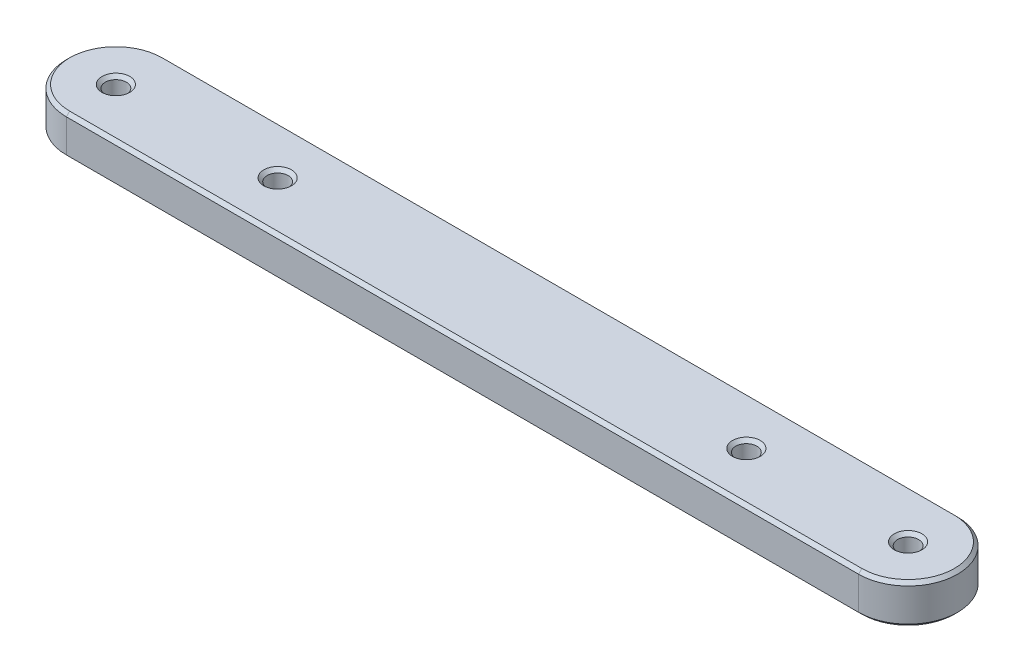
ISO-10303-21;
HEADER;
FILE_DESCRIPTION(('STEP AP214'),'2;1');
FILE_NAME('part.step','',(''),(''),'','','');
FILE_SCHEMA(('AUTOMOTIVE_DESIGN { 1 0 10303 214 1 1 1 1 }'));
ENDSEC;
DATA;
#1=APPLICATION_CONTEXT('core data for automotive mechanical design processes');
#2=APPLICATION_PROTOCOL_DEFINITION('international standard','automotive_design',2000,#1);
#3=PRODUCT_CONTEXT('',#1,'mechanical');
#4=PRODUCT('Part','Part','',(#3));
#5=PRODUCT_RELATED_PRODUCT_CATEGORY('part','',(#4));
#6=PRODUCT_DEFINITION_FORMATION('','',#4);
#7=PRODUCT_DEFINITION_CONTEXT('part definition',#1,'design');
#8=PRODUCT_DEFINITION('design','',#6,#7);
#9=PRODUCT_DEFINITION_SHAPE('','',#8);
#10=(LENGTH_UNIT() NAMED_UNIT(*) SI_UNIT(.MILLI.,.METRE.));
#11=(NAMED_UNIT(*) PLANE_ANGLE_UNIT() SI_UNIT($,.RADIAN.));
#12=(NAMED_UNIT(*) SI_UNIT($,.STERADIAN.) SOLID_ANGLE_UNIT());
#13=UNCERTAINTY_MEASURE_WITH_UNIT(LENGTH_MEASURE(1.E-05),#10,'distance_accuracy_value','');
#14=(GEOMETRIC_REPRESENTATION_CONTEXT(3) GLOBAL_UNCERTAINTY_ASSIGNED_CONTEXT((#13)) GLOBAL_UNIT_ASSIGNED_CONTEXT((#10,
#11,#12)) REPRESENTATION_CONTEXT('',''));
#15=CARTESIAN_POINT('',(0.,0.,0.));
#16=DIRECTION('',(0.,0.,1.));
#17=DIRECTION('',(1.,0.,0.));
#18=AXIS2_PLACEMENT_3D('',#15,#16,#17);
#19=CARTESIAN_POINT('',(0.,3.,7.5));
#20=DIRECTION('',(0.,0.,-1.));
#21=DIRECTION('',(-1.,0.,0.));
#22=AXIS2_PLACEMENT_3D('',#19,#20,#21);
#23=PLANE('',#22);
#24=DIRECTION('',(0.,-1.,0.));
#25=VECTOR('',#24,1.);
#26=CARTESIAN_POINT('',(0.,3.,7.5));
#27=LINE('',#26,#25);
#28=CARTESIAN_POINT('',(0.,2.5,7.5));
#29=VERTEX_POINT('',#28);
#30=CARTESIAN_POINT('',(0.,-2.5,7.5));
#31=VERTEX_POINT('',#30);
#32=EDGE_CURVE('E163',#29,#31,#27,.T.);
#33=ORIENTED_EDGE('',*,*,#32,.T.);
#34=DIRECTION('',(1.,0.,0.));
#35=VECTOR('',#34,1.);
#36=CARTESIAN_POINT('',(0.,-2.5,7.5));
#37=LINE('',#36,#35);
#38=CARTESIAN_POINT('',(120.,-2.5,7.5));
#39=VERTEX_POINT('',#38);
#40=EDGE_CURVE('E225',#31,#39,#37,.T.);
#41=ORIENTED_EDGE('',*,*,#40,.T.);
#42=DIRECTION('',(0.,-1.,0.));
#43=VECTOR('',#42,1.);
#44=CARTESIAN_POINT('',(120.,3.,7.5));
#45=LINE('',#44,#43);
#46=CARTESIAN_POINT('',(120.,2.5,7.5));
#47=VERTEX_POINT('',#46);
#48=EDGE_CURVE('E133',#47,#39,#45,.T.);
#49=ORIENTED_EDGE('',*,*,#48,.F.);
#50=DIRECTION('',(-1.,0.,0.));
#51=VECTOR('',#50,1.);
#52=CARTESIAN_POINT('',(0.,2.5,7.5));
#53=LINE('',#52,#51);
#54=EDGE_CURVE('E228',#47,#29,#53,.T.);
#55=ORIENTED_EDGE('',*,*,#54,.T.);
#56=EDGE_LOOP('',(#33,#41,#49,#55));
#57=FACE_BOUND('',#56,.T.);
#58=ADVANCED_FACE('F42',(#57),#23,.F.);
#59=CARTESIAN_POINT('',(120.,3.,0.));
#60=DIRECTION('',(0.,-1.,0.));
#61=DIRECTION('',(0.,0.,-1.));
#62=AXIS2_PLACEMENT_3D('',#59,#60,#61);
#63=CYLINDRICAL_SURFACE('',#62,7.5);
#64=ORIENTED_EDGE('',*,*,#48,.T.);
#65=CARTESIAN_POINT('',(120.,-2.5,0.));
#66=DIRECTION('',(0.,1.,0.));
#67=DIRECTION('',(0.,0.,1.));
#68=AXIS2_PLACEMENT_3D('',#65,#66,#67);
#69=CIRCLE('',#68,7.5);
#70=CARTESIAN_POINT('',(120.,-2.5,-7.5));
#71=VERTEX_POINT('',#70);
#72=EDGE_CURVE('E131',#39,#71,#69,.T.);
#73=ORIENTED_EDGE('',*,*,#72,.T.);
#74=DIRECTION('',(0.,-1.,0.));
#75=VECTOR('',#74,1.);
#76=CARTESIAN_POINT('',(120.,3.,-7.5));
#77=LINE('',#76,#75);
#78=CARTESIAN_POINT('',(120.,2.5,-7.5));
#79=VERTEX_POINT('',#78);
#80=EDGE_CURVE('E113',#79,#71,#77,.T.);
#81=ORIENTED_EDGE('',*,*,#80,.F.);
#82=CARTESIAN_POINT('',(120.,2.5,0.));
#83=DIRECTION('',(0.,1.,0.));
#84=DIRECTION('',(0.,0.,1.));
#85=AXIS2_PLACEMENT_3D('',#82,#83,#84);
#86=CIRCLE('',#85,7.5);
#87=EDGE_CURVE('E128',#79,#47,#86,.F.);
#88=ORIENTED_EDGE('',*,*,#87,.T.);
#89=EDGE_LOOP('',(#64,#73,#81,#88));
#90=FACE_BOUND('',#89,.T.);
#91=ADVANCED_FACE('F127',(#90),#63,.T.);
#92=CARTESIAN_POINT('',(0.,3.,-7.5));
#93=DIRECTION('',(0.,0.,-1.));
#94=DIRECTION('',(-1.,0.,0.));
#95=AXIS2_PLACEMENT_3D('',#92,#93,#94);
#96=PLANE('',#95);
#97=ORIENTED_EDGE('',*,*,#80,.T.);
#98=DIRECTION('',(-1.,0.,0.));
#99=VECTOR('',#98,1.);
#100=CARTESIAN_POINT('',(0.,-2.5,-7.5));
#101=LINE('',#100,#99);
#102=CARTESIAN_POINT('',(0.,-2.5,-7.5));
#103=VERTEX_POINT('',#102);
#104=EDGE_CURVE('E120',#71,#103,#101,.T.);
#105=ORIENTED_EDGE('',*,*,#104,.T.);
#106=DIRECTION('',(0.,-1.,0.));
#107=VECTOR('',#106,1.);
#108=CARTESIAN_POINT('',(0.,3.,-7.5));
#109=LINE('',#108,#107);
#110=CARTESIAN_POINT('',(0.,2.5,-7.5));
#111=VERTEX_POINT('',#110);
#112=EDGE_CURVE('E115',#111,#103,#109,.T.);
#113=ORIENTED_EDGE('',*,*,#112,.F.);
#114=DIRECTION('',(1.,0.,0.));
#115=VECTOR('',#114,1.);
#116=CARTESIAN_POINT('',(0.,2.5,-7.5));
#117=LINE('',#116,#115);
#118=EDGE_CURVE('E110',#111,#79,#117,.T.);
#119=ORIENTED_EDGE('',*,*,#118,.T.);
#120=EDGE_LOOP('',(#97,#105,#113,#119));
#121=FACE_BOUND('',#120,.T.);
#122=ADVANCED_FACE('F112',(#121),#96,.T.);
#123=CARTESIAN_POINT('',(120.,3.,0.));
#124=DIRECTION('',(0.,-1.,0.));
#125=DIRECTION('',(0.,0.,-1.));
#126=AXIS2_PLACEMENT_3D('',#123,#124,#125);
#127=CYLINDRICAL_SURFACE('',#126,1.60000000000001);
#128=CARTESIAN_POINT('',(120.,-2.49999999999999,0.));
#129=DIRECTION('',(0.,1.,0.));
#130=DIRECTION('',(0.,0.,1.));
#131=AXIS2_PLACEMENT_3D('',#128,#129,#130);
#132=CIRCLE('',#131,1.60000000000001);
#133=CARTESIAN_POINT('',(120.,-2.49999999999999,1.60000000000001));
#134=VERTEX_POINT('',#133);
#135=EDGE_CURVE('E217',#134,#134,#132,.F.);
#136=ORIENTED_EDGE('',*,*,#135,.T.);
#137=EDGE_LOOP('',(#136));
#138=FACE_BOUND('',#137,.T.);
#139=CARTESIAN_POINT('',(120.,2.5,0.));
#140=DIRECTION('',(0.,1.,0.));
#141=DIRECTION('',(0.,0.,1.));
#142=AXIS2_PLACEMENT_3D('',#139,#140,#141);
#143=CIRCLE('',#142,1.60000000000001);
#144=CARTESIAN_POINT('',(120.,2.5,1.60000000000001));
#145=VERTEX_POINT('',#144);
#146=EDGE_CURVE('E221',#145,#145,#143,.T.);
#147=ORIENTED_EDGE('',*,*,#146,.T.);
#148=EDGE_LOOP('',(#147));
#149=FACE_BOUND('',#148,.T.);
#150=ADVANCED_FACE('F344',(#138,#149),#127,.F.);
#151=CARTESIAN_POINT('',(0.,3.,0.));
#152=DIRECTION('',(0.,-1.,0.));
#153=DIRECTION('',(0.,0.,-1.));
#154=AXIS2_PLACEMENT_3D('',#151,#152,#153);
#155=CYLINDRICAL_SURFACE('',#154,1.6);
#156=CARTESIAN_POINT('',(0.,-2.49999999999999,0.));
#157=DIRECTION('',(0.,1.,0.));
#158=DIRECTION('',(0.,0.,1.));
#159=AXIS2_PLACEMENT_3D('',#156,#157,#158);
#160=CIRCLE('',#159,1.6);
#161=CARTESIAN_POINT('',(0.,-2.49999999999999,1.6));
#162=VERTEX_POINT('',#161);
#163=EDGE_CURVE('E209',#162,#162,#160,.F.);
#164=ORIENTED_EDGE('',*,*,#163,.T.);
#165=EDGE_LOOP('',(#164));
#166=FACE_BOUND('',#165,.T.);
#167=CARTESIAN_POINT('',(0.,2.49999999999999,0.));
#168=DIRECTION('',(0.,1.,0.));
#169=DIRECTION('',(0.,0.,1.));
#170=AXIS2_PLACEMENT_3D('',#167,#168,#169);
#171=CIRCLE('',#170,1.6);
#172=CARTESIAN_POINT('',(0.,2.49999999999999,1.6));
#173=VERTEX_POINT('',#172);
#174=EDGE_CURVE('E213',#173,#173,#171,.T.);
#175=ORIENTED_EDGE('',*,*,#174,.T.);
#176=EDGE_LOOP('',(#175));
#177=FACE_BOUND('',#176,.T.);
#178=ADVANCED_FACE('F332',(#166,#177),#155,.F.);
#179=CARTESIAN_POINT('',(24.5,3.,0.));
#180=DIRECTION('',(0.,-1.,0.));
#181=DIRECTION('',(0.,0.,-1.));
#182=AXIS2_PLACEMENT_3D('',#179,#180,#181);
#183=CYLINDRICAL_SURFACE('',#182,1.6);
#184=CARTESIAN_POINT('',(24.5,-2.49999999999999,0.));
#185=DIRECTION('',(0.,1.,0.));
#186=DIRECTION('',(0.,0.,1.));
#187=AXIS2_PLACEMENT_3D('',#184,#185,#186);
#188=CIRCLE('',#187,1.6);
#189=CARTESIAN_POINT('',(24.5,-2.49999999999999,1.6));
#190=VERTEX_POINT('',#189);
#191=EDGE_CURVE('E201',#190,#190,#188,.F.);
#192=ORIENTED_EDGE('',*,*,#191,.T.);
#193=EDGE_LOOP('',(#192));
#194=FACE_BOUND('',#193,.T.);
#195=CARTESIAN_POINT('',(24.5,2.49999999999999,0.));
#196=DIRECTION('',(0.,1.,0.));
#197=DIRECTION('',(0.,0.,1.));
#198=AXIS2_PLACEMENT_3D('',#195,#196,#197);
#199=CIRCLE('',#198,1.6);
#200=CARTESIAN_POINT('',(24.5,2.49999999999999,1.6));
#201=VERTEX_POINT('',#200);
#202=EDGE_CURVE('E205',#201,#201,#199,.T.);
#203=ORIENTED_EDGE('',*,*,#202,.T.);
#204=EDGE_LOOP('',(#203));
#205=FACE_BOUND('',#204,.T.);
#206=ADVANCED_FACE('F324',(#194,#205),#183,.F.);
#207=CARTESIAN_POINT('',(95.5,3.,0.));
#208=DIRECTION('',(0.,-1.,0.));
#209=DIRECTION('',(0.,0.,-1.));
#210=AXIS2_PLACEMENT_3D('',#207,#208,#209);
#211=CYLINDRICAL_SURFACE('',#210,1.60000000000001);
#212=CARTESIAN_POINT('',(95.5,-2.49999999999999,0.));
#213=DIRECTION('',(0.,1.,0.));
#214=DIRECTION('',(0.,0.,1.));
#215=AXIS2_PLACEMENT_3D('',#212,#213,#214);
#216=CIRCLE('',#215,1.60000000000001);
#217=CARTESIAN_POINT('',(95.5,-2.49999999999999,1.6));
#218=VERTEX_POINT('',#217);
#219=EDGE_CURVE('E193',#218,#218,#216,.F.);
#220=ORIENTED_EDGE('',*,*,#219,.T.);
#221=EDGE_LOOP('',(#220));
#222=FACE_BOUND('',#221,.T.);
#223=CARTESIAN_POINT('',(95.5,2.5,0.));
#224=DIRECTION('',(0.,1.,0.));
#225=DIRECTION('',(0.,0.,1.));
#226=AXIS2_PLACEMENT_3D('',#223,#224,#225);
#227=CIRCLE('',#226,1.60000000000001);
#228=CARTESIAN_POINT('',(95.5,2.5,1.6));
#229=VERTEX_POINT('',#228);
#230=EDGE_CURVE('E197',#229,#229,#227,.T.);
#231=ORIENTED_EDGE('',*,*,#230,.T.);
#232=EDGE_LOOP('',(#231));
#233=FACE_BOUND('',#232,.T.);
#234=ADVANCED_FACE('F322',(#222,#233),#211,.F.);
#235=CARTESIAN_POINT('',(0.,3.,0.));
#236=DIRECTION('',(0.,-1.,0.));
#237=DIRECTION('',(0.,0.,-1.));
#238=AXIS2_PLACEMENT_3D('',#235,#236,#237);
#239=CYLINDRICAL_SURFACE('',#238,7.5);
#240=ORIENTED_EDGE('',*,*,#112,.T.);
#241=CARTESIAN_POINT('',(0.,-2.5,0.));
#242=DIRECTION('',(0.,1.,0.));
#243=DIRECTION('',(0.,0.,1.));
#244=AXIS2_PLACEMENT_3D('',#241,#242,#243);
#245=CIRCLE('',#244,7.5);
#246=EDGE_CURVE('E231',#103,#31,#245,.T.);
#247=ORIENTED_EDGE('',*,*,#246,.T.);
#248=ORIENTED_EDGE('',*,*,#32,.F.);
#249=CARTESIAN_POINT('',(0.,2.5,0.));
#250=DIRECTION('',(0.,1.,0.));
#251=DIRECTION('',(0.,0.,1.));
#252=AXIS2_PLACEMENT_3D('',#249,#250,#251);
#253=CIRCLE('',#252,7.5);
#254=EDGE_CURVE('E234',#29,#111,#253,.F.);
#255=ORIENTED_EDGE('',*,*,#254,.T.);
#256=EDGE_LOOP('',(#240,#247,#248,#255));
#257=FACE_BOUND('',#256,.T.);
#258=ADVANCED_FACE('F298',(#257),#239,.T.);
#259=CARTESIAN_POINT('',(0.,3.,0.));
#260=DIRECTION('',(0.,1.,0.));
#261=DIRECTION('',(0.,0.,1.));
#262=AXIS2_PLACEMENT_3D('',#259,#260,#261);
#263=PLANE('',#262);
#264=DIRECTION('',(-1.,0.,0.));
#265=VECTOR('',#264,1.);
#266=CARTESIAN_POINT('',(0.,3.,-7.));
#267=LINE('',#266,#265);
#268=CARTESIAN_POINT('',(120.,3.,-7.));
#269=VERTEX_POINT('',#268);
#270=CARTESIAN_POINT('',(0.,3.,-7.));
#271=VERTEX_POINT('',#270);
#272=EDGE_CURVE('E53',#269,#271,#267,.T.);
#273=ORIENTED_EDGE('',*,*,#272,.T.);
#274=CARTESIAN_POINT('',(0.,3.,0.));
#275=DIRECTION('',(0.,1.,0.));
#276=DIRECTION('',(0.,0.,1.));
#277=AXIS2_PLACEMENT_3D('',#274,#275,#276);
#278=CIRCLE('',#277,7.);
#279=CARTESIAN_POINT('',(0.,3.,7.));
#280=VERTEX_POINT('',#279);
#281=EDGE_CURVE('E11',#271,#280,#278,.T.);
#282=ORIENTED_EDGE('',*,*,#281,.T.);
#283=DIRECTION('',(1.,0.,0.));
#284=VECTOR('',#283,1.);
#285=CARTESIAN_POINT('',(120.,3.,7.));
#286=LINE('',#285,#284);
#287=CARTESIAN_POINT('',(120.,3.,7.));
#288=VERTEX_POINT('',#287);
#289=EDGE_CURVE('E174',#280,#288,#286,.T.);
#290=ORIENTED_EDGE('',*,*,#289,.T.);
#291=CARTESIAN_POINT('',(120.,3.,0.));
#292=DIRECTION('',(0.,1.,0.));
#293=DIRECTION('',(0.,0.,1.));
#294=AXIS2_PLACEMENT_3D('',#291,#292,#293);
#295=CIRCLE('',#294,7.);
#296=EDGE_CURVE('E64',#288,#269,#295,.T.);
#297=ORIENTED_EDGE('',*,*,#296,.T.);
#298=EDGE_LOOP('',(#273,#282,#290,#297));
#299=FACE_BOUND('',#298,.T.);
#300=CARTESIAN_POINT('',(120.,3.,0.));
#301=DIRECTION('',(0.,1.,0.));
#302=DIRECTION('',(0.,0.,1.));
#303=AXIS2_PLACEMENT_3D('',#300,#301,#302);
#304=CIRCLE('',#303,2.1);
#305=CARTESIAN_POINT('',(120.,3.,2.1));
#306=VERTEX_POINT('',#305);
#307=EDGE_CURVE('E177',#306,#306,#304,.F.);
#308=ORIENTED_EDGE('',*,*,#307,.T.);
#309=EDGE_LOOP('',(#308));
#310=FACE_BOUND('',#309,.T.);
#311=CARTESIAN_POINT('',(0.,3.,0.));
#312=DIRECTION('',(0.,1.,0.));
#313=DIRECTION('',(0.,0.,1.));
#314=AXIS2_PLACEMENT_3D('',#311,#312,#313);
#315=CIRCLE('',#314,2.1);
#316=CARTESIAN_POINT('',(0.,3.,2.1));
#317=VERTEX_POINT('',#316);
#318=EDGE_CURVE('E181',#317,#317,#315,.F.);
#319=ORIENTED_EDGE('',*,*,#318,.T.);
#320=EDGE_LOOP('',(#319));
#321=FACE_BOUND('',#320,.T.);
#322=CARTESIAN_POINT('',(24.5,3.,0.));
#323=DIRECTION('',(0.,1.,0.));
#324=DIRECTION('',(0.,0.,1.));
#325=AXIS2_PLACEMENT_3D('',#322,#323,#324);
#326=CIRCLE('',#325,2.1);
#327=CARTESIAN_POINT('',(24.5,3.,2.1));
#328=VERTEX_POINT('',#327);
#329=EDGE_CURVE('E185',#328,#328,#326,.F.);
#330=ORIENTED_EDGE('',*,*,#329,.T.);
#331=EDGE_LOOP('',(#330));
#332=FACE_BOUND('',#331,.T.);
#333=CARTESIAN_POINT('',(95.5,3.,0.));
#334=DIRECTION('',(0.,1.,0.));
#335=DIRECTION('',(0.,0.,1.));
#336=AXIS2_PLACEMENT_3D('',#333,#334,#335);
#337=CIRCLE('',#336,2.1);
#338=CARTESIAN_POINT('',(95.5,3.,2.1));
#339=VERTEX_POINT('',#338);
#340=EDGE_CURVE('E189',#339,#339,#337,.F.);
#341=ORIENTED_EDGE('',*,*,#340,.T.);
#342=EDGE_LOOP('',(#341));
#343=FACE_BOUND('',#342,.T.);
#344=ADVANCED_FACE('F304',(#299,#310,#321,#332,#343),#263,.T.);
#345=CARTESIAN_POINT('',(0.,-3.,0.));
#346=DIRECTION('',(0.,1.,0.));
#347=DIRECTION('',(0.,0.,1.));
#348=AXIS2_PLACEMENT_3D('',#345,#346,#347);
#349=PLANE('',#348);
#350=DIRECTION('',(1.,0.,0.));
#351=VECTOR('',#350,1.);
#352=CARTESIAN_POINT('',(120.,-3.,-7.));
#353=LINE('',#352,#351);
#354=CARTESIAN_POINT('',(0.,-3.,-7.));
#355=VERTEX_POINT('',#354);
#356=CARTESIAN_POINT('',(120.,-3.,-7.));
#357=VERTEX_POINT('',#356);
#358=EDGE_CURVE('E242',#355,#357,#353,.T.);
#359=ORIENTED_EDGE('',*,*,#358,.T.);
#360=CARTESIAN_POINT('',(120.,-3.,0.));
#361=DIRECTION('',(0.,1.,0.));
#362=DIRECTION('',(0.,0.,1.));
#363=AXIS2_PLACEMENT_3D('',#360,#361,#362);
#364=CIRCLE('',#363,7.);
#365=CARTESIAN_POINT('',(120.,-3.,7.));
#366=VERTEX_POINT('',#365);
#367=EDGE_CURVE('E121',#357,#366,#364,.F.);
#368=ORIENTED_EDGE('',*,*,#367,.T.);
#369=DIRECTION('',(-1.,0.,0.));
#370=VECTOR('',#369,1.);
#371=CARTESIAN_POINT('',(0.,-3.,7.));
#372=LINE('',#371,#370);
#373=CARTESIAN_POINT('',(0.,-3.,7.));
#374=VERTEX_POINT('',#373);
#375=EDGE_CURVE('E248',#366,#374,#372,.T.);
#376=ORIENTED_EDGE('',*,*,#375,.T.);
#377=CARTESIAN_POINT('',(0.,-3.,0.));
#378=DIRECTION('',(0.,1.,0.));
#379=DIRECTION('',(0.,0.,1.));
#380=AXIS2_PLACEMENT_3D('',#377,#378,#379);
#381=CIRCLE('',#380,7.);
#382=EDGE_CURVE('E245',#374,#355,#381,.F.);
#383=ORIENTED_EDGE('',*,*,#382,.T.);
#384=EDGE_LOOP('',(#359,#368,#376,#383));
#385=FACE_BOUND('',#384,.T.);
#386=CARTESIAN_POINT('',(120.,-3.,0.));
#387=DIRECTION('',(0.,1.,0.));
#388=DIRECTION('',(0.,0.,1.));
#389=AXIS2_PLACEMENT_3D('',#386,#387,#388);
#390=CIRCLE('',#389,2.10000000000002);
#391=CARTESIAN_POINT('',(120.,-3.,2.10000000000002));
#392=VERTEX_POINT('',#391);
#393=EDGE_CURVE('E251',#392,#392,#390,.T.);
#394=ORIENTED_EDGE('',*,*,#393,.T.);
#395=EDGE_LOOP('',(#394));
#396=FACE_BOUND('',#395,.T.);
#397=CARTESIAN_POINT('',(0.,-3.,0.));
#398=DIRECTION('',(0.,1.,0.));
#399=DIRECTION('',(0.,0.,1.));
#400=AXIS2_PLACEMENT_3D('',#397,#398,#399);
#401=CIRCLE('',#400,2.10000000000002);
#402=CARTESIAN_POINT('',(0.,-3.,2.10000000000002));
#403=VERTEX_POINT('',#402);
#404=EDGE_CURVE('E255',#403,#403,#401,.T.);
#405=ORIENTED_EDGE('',*,*,#404,.T.);
#406=EDGE_LOOP('',(#405));
#407=FACE_BOUND('',#406,.T.);
#408=CARTESIAN_POINT('',(24.5,-3.,0.));
#409=DIRECTION('',(0.,1.,0.));
#410=DIRECTION('',(0.,0.,1.));
#411=AXIS2_PLACEMENT_3D('',#408,#409,#410);
#412=CIRCLE('',#411,2.10000000000002);
#413=CARTESIAN_POINT('',(24.5,-3.,2.10000000000002));
#414=VERTEX_POINT('',#413);
#415=EDGE_CURVE('E259',#414,#414,#412,.T.);
#416=ORIENTED_EDGE('',*,*,#415,.T.);
#417=EDGE_LOOP('',(#416));
#418=FACE_BOUND('',#417,.T.);
#419=CARTESIAN_POINT('',(95.5,-3.,0.));
#420=DIRECTION('',(0.,1.,0.));
#421=DIRECTION('',(0.,0.,1.));
#422=AXIS2_PLACEMENT_3D('',#419,#420,#421);
#423=CIRCLE('',#422,2.10000000000002);
#424=CARTESIAN_POINT('',(95.5,-3.,2.10000000000001));
#425=VERTEX_POINT('',#424);
#426=EDGE_CURVE('E263',#425,#425,#423,.T.);
#427=ORIENTED_EDGE('',*,*,#426,.T.);
#428=EDGE_LOOP('',(#427));
#429=FACE_BOUND('',#428,.T.);
#430=ADVANCED_FACE('F307',(#385,#396,#407,#418,#429),#349,.F.);
#431=CARTESIAN_POINT('',(0.,-2.5,0.));
#432=DIRECTION('',(0.,1.,0.));
#433=DIRECTION('',(0.,0.,1.));
#434=AXIS2_PLACEMENT_3D('',#431,#432,#433);
#435=CONICAL_SURFACE('',#434,7.5,0.785398163397448);
#436=DIRECTION('',(0.,0.707106781186547,-0.707106781186547));
#437=VECTOR('',#436,1.);
#438=CARTESIAN_POINT('',(0.,-3.,-7.));
#439=LINE('',#438,#437);
#440=EDGE_CURVE('E164',#355,#103,#439,.T.);
#441=ORIENTED_EDGE('',*,*,#440,.F.);
#442=ORIENTED_EDGE('',*,*,#382,.F.);
#443=DIRECTION('',(0.,-0.707106781186547,-0.707106781186547));
#444=VECTOR('',#443,1.);
#445=CARTESIAN_POINT('',(0.,-2.5,7.5));
#446=LINE('',#445,#444);
#447=EDGE_CURVE('E159',#31,#374,#446,.T.);
#448=ORIENTED_EDGE('',*,*,#447,.F.);
#449=ORIENTED_EDGE('',*,*,#246,.F.);
#450=EDGE_LOOP('',(#441,#442,#448,#449));
#451=FACE_BOUND('',#450,.T.);
#452=ADVANCED_FACE('F285',(#451),#435,.T.);
#453=CARTESIAN_POINT('',(0.,-2.5,7.5));
#454=DIRECTION('',(0.,0.707106781186547,-0.707106781186547));
#455=DIRECTION('',(1.,0.,0.));
#456=AXIS2_PLACEMENT_3D('',#453,#454,#455);
#457=PLANE('',#456);
#458=ORIENTED_EDGE('',*,*,#447,.T.);
#459=ORIENTED_EDGE('',*,*,#375,.F.);
#460=DIRECTION('',(0.,-0.707106781186547,-0.707106781186547));
#461=VECTOR('',#460,1.);
#462=CARTESIAN_POINT('',(120.,-2.5,7.5));
#463=LINE('',#462,#461);
#464=EDGE_CURVE('E148',#39,#366,#463,.T.);
#465=ORIENTED_EDGE('',*,*,#464,.F.);
#466=ORIENTED_EDGE('',*,*,#40,.F.);
#467=EDGE_LOOP('',(#458,#459,#465,#466));
#468=FACE_BOUND('',#467,.T.);
#469=ADVANCED_FACE('F289',(#468),#457,.F.);
#470=CARTESIAN_POINT('',(0.,-3.,-7.));
#471=DIRECTION('',(0.,-0.707106781186547,-0.707106781186547));
#472=DIRECTION('',(-1.,0.,0.));
#473=AXIS2_PLACEMENT_3D('',#470,#471,#472);
#474=PLANE('',#473);
#475=ORIENTED_EDGE('',*,*,#440,.T.);
#476=ORIENTED_EDGE('',*,*,#104,.F.);
#477=DIRECTION('',(0.,0.707106781186547,-0.707106781186547));
#478=VECTOR('',#477,1.);
#479=CARTESIAN_POINT('',(120.,-3.,-7.));
#480=LINE('',#479,#478);
#481=EDGE_CURVE('E145',#357,#71,#480,.T.);
#482=ORIENTED_EDGE('',*,*,#481,.F.);
#483=ORIENTED_EDGE('',*,*,#358,.F.);
#484=EDGE_LOOP('',(#475,#476,#482,#483));
#485=FACE_BOUND('',#484,.T.);
#486=ADVANCED_FACE('F297',(#485),#474,.T.);
#487=CARTESIAN_POINT('',(120.,-2.5,0.));
#488=DIRECTION('',(0.,1.,0.));
#489=DIRECTION('',(0.,0.,1.));
#490=AXIS2_PLACEMENT_3D('',#487,#488,#489);
#491=CONICAL_SURFACE('',#490,7.5,0.785398163397448);
#492=ORIENTED_EDGE('',*,*,#464,.T.);
#493=ORIENTED_EDGE('',*,*,#367,.F.);
#494=ORIENTED_EDGE('',*,*,#481,.T.);
#495=ORIENTED_EDGE('',*,*,#72,.F.);
#496=EDGE_LOOP('',(#492,#493,#494,#495));
#497=FACE_BOUND('',#496,.T.);
#498=ADVANCED_FACE('F292',(#497),#491,.T.);
#499=CARTESIAN_POINT('',(120.,-3.,0.));
#500=DIRECTION('',(0.,-1.,0.));
#501=DIRECTION('',(0.,0.,-1.));
#502=AXIS2_PLACEMENT_3D('',#499,#500,#501);
#503=CONICAL_SURFACE('',#502,2.10000000000002,0.785398163397454);
#504=ORIENTED_EDGE('',*,*,#135,.F.);
#505=EDGE_LOOP('',(#504));
#506=FACE_BOUND('',#505,.T.);
#507=ORIENTED_EDGE('',*,*,#393,.F.);
#508=EDGE_LOOP('',(#507));
#509=FACE_BOUND('',#508,.T.);
#510=ADVANCED_FACE('F421',(#506,#509),#503,.F.);
#511=CARTESIAN_POINT('',(0.,-3.,0.));
#512=DIRECTION('',(0.,-1.,0.));
#513=DIRECTION('',(0.,0.,-1.));
#514=AXIS2_PLACEMENT_3D('',#511,#512,#513);
#515=CONICAL_SURFACE('',#514,2.10000000000002,0.785398163397454);
#516=ORIENTED_EDGE('',*,*,#163,.F.);
#517=EDGE_LOOP('',(#516));
#518=FACE_BOUND('',#517,.T.);
#519=ORIENTED_EDGE('',*,*,#404,.F.);
#520=EDGE_LOOP('',(#519));
#521=FACE_BOUND('',#520,.T.);
#522=ADVANCED_FACE('F414',(#518,#521),#515,.F.);
#523=CARTESIAN_POINT('',(24.5,-3.,0.));
#524=DIRECTION('',(0.,-1.,0.));
#525=DIRECTION('',(0.,0.,-1.));
#526=AXIS2_PLACEMENT_3D('',#523,#524,#525);
#527=CONICAL_SURFACE('',#526,2.10000000000002,0.785398163397454);
#528=ORIENTED_EDGE('',*,*,#191,.F.);
#529=EDGE_LOOP('',(#528));
#530=FACE_BOUND('',#529,.T.);
#531=ORIENTED_EDGE('',*,*,#415,.F.);
#532=EDGE_LOOP('',(#531));
#533=FACE_BOUND('',#532,.T.);
#534=ADVANCED_FACE('F407',(#530,#533),#527,.F.);
#535=CARTESIAN_POINT('',(95.5,-3.,0.));
#536=DIRECTION('',(0.,-1.,0.));
#537=DIRECTION('',(0.,0.,-1.));
#538=AXIS2_PLACEMENT_3D('',#535,#536,#537);
#539=CONICAL_SURFACE('',#538,2.10000000000002,0.785398163397454);
#540=ORIENTED_EDGE('',*,*,#219,.F.);
#541=EDGE_LOOP('',(#540));
#542=FACE_BOUND('',#541,.T.);
#543=ORIENTED_EDGE('',*,*,#426,.F.);
#544=EDGE_LOOP('',(#543));
#545=FACE_BOUND('',#544,.T.);
#546=ADVANCED_FACE('F388',(#542,#545),#539,.F.);
#547=CARTESIAN_POINT('',(120.,3.,0.));
#548=DIRECTION('',(0.,-1.,0.));
#549=DIRECTION('',(0.,0.,-1.));
#550=AXIS2_PLACEMENT_3D('',#547,#548,#549);
#551=CONICAL_SURFACE('',#550,7.,0.785398163397448);
#552=DIRECTION('',(0.,0.707106781186547,-0.707106781186547));
#553=VECTOR('',#552,1.);
#554=CARTESIAN_POINT('',(120.,2.5,7.5));
#555=LINE('',#554,#553);
#556=EDGE_CURVE('E139',#47,#288,#555,.T.);
#557=ORIENTED_EDGE('',*,*,#556,.F.);
#558=ORIENTED_EDGE('',*,*,#87,.F.);
#559=DIRECTION('',(0.,-0.707106781186547,-0.707106781186547));
#560=VECTOR('',#559,1.);
#561=CARTESIAN_POINT('',(120.,3.,-7.));
#562=LINE('',#561,#560);
#563=EDGE_CURVE('E47',#269,#79,#562,.T.);
#564=ORIENTED_EDGE('',*,*,#563,.F.);
#565=ORIENTED_EDGE('',*,*,#296,.F.);
#566=EDGE_LOOP('',(#557,#558,#564,#565));
#567=FACE_BOUND('',#566,.T.);
#568=ADVANCED_FACE('F137',(#567),#551,.T.);
#569=CARTESIAN_POINT('',(0.,2.5,-7.5));
#570=DIRECTION('',(0.,-0.707106781186547,0.707106781186547));
#571=DIRECTION('',(1.,0.,0.));
#572=AXIS2_PLACEMENT_3D('',#569,#570,#571);
#573=PLANE('',#572);
#574=ORIENTED_EDGE('',*,*,#563,.T.);
#575=ORIENTED_EDGE('',*,*,#118,.F.);
#576=DIRECTION('',(0.,-0.707106781186547,-0.707106781186547));
#577=VECTOR('',#576,1.);
#578=CARTESIAN_POINT('',(0.,3.,-7.));
#579=LINE('',#578,#577);
#580=EDGE_CURVE('E150',#271,#111,#579,.T.);
#581=ORIENTED_EDGE('',*,*,#580,.F.);
#582=ORIENTED_EDGE('',*,*,#272,.F.);
#583=EDGE_LOOP('',(#574,#575,#581,#582));
#584=FACE_BOUND('',#583,.T.);
#585=ADVANCED_FACE('F143',(#584),#573,.F.);
#586=CARTESIAN_POINT('',(0.,3.,7.));
#587=DIRECTION('',(0.,0.707106781186547,0.707106781186547));
#588=DIRECTION('',(-1.,0.,0.));
#589=AXIS2_PLACEMENT_3D('',#586,#587,#588);
#590=PLANE('',#589);
#591=ORIENTED_EDGE('',*,*,#556,.T.);
#592=ORIENTED_EDGE('',*,*,#289,.F.);
#593=DIRECTION('',(0.,0.707106781186547,-0.707106781186547));
#594=VECTOR('',#593,1.);
#595=CARTESIAN_POINT('',(0.,2.5,7.5));
#596=LINE('',#595,#594);
#597=EDGE_CURVE('E154',#29,#280,#596,.T.);
#598=ORIENTED_EDGE('',*,*,#597,.F.);
#599=ORIENTED_EDGE('',*,*,#54,.F.);
#600=EDGE_LOOP('',(#591,#592,#598,#599));
#601=FACE_BOUND('',#600,.T.);
#602=ADVANCED_FACE('F303',(#601),#590,.T.);
#603=CARTESIAN_POINT('',(0.,3.,0.));
#604=DIRECTION('',(0.,-1.,0.));
#605=DIRECTION('',(0.,0.,-1.));
#606=AXIS2_PLACEMENT_3D('',#603,#604,#605);
#607=CONICAL_SURFACE('',#606,7.,0.785398163397448);
#608=ORIENTED_EDGE('',*,*,#580,.T.);
#609=ORIENTED_EDGE('',*,*,#254,.F.);
#610=ORIENTED_EDGE('',*,*,#597,.T.);
#611=ORIENTED_EDGE('',*,*,#281,.F.);
#612=EDGE_LOOP('',(#608,#609,#610,#611));
#613=FACE_BOUND('',#612,.T.);
#614=ADVANCED_FACE('F301',(#613),#607,.T.);
#615=CARTESIAN_POINT('',(120.,2.5,0.));
#616=DIRECTION('',(0.,1.,0.));
#617=DIRECTION('',(0.,0.,1.));
#618=AXIS2_PLACEMENT_3D('',#615,#616,#617);
#619=CONICAL_SURFACE('',#618,1.60000000000001,0.785398163397443);
#620=ORIENTED_EDGE('',*,*,#307,.F.);
#621=EDGE_LOOP('',(#620));
#622=FACE_BOUND('',#621,.T.);
#623=ORIENTED_EDGE('',*,*,#146,.F.);
#624=EDGE_LOOP('',(#623));
#625=FACE_BOUND('',#624,.T.);
#626=ADVANCED_FACE('F358',(#622,#625),#619,.F.);
#627=CARTESIAN_POINT('',(0.,2.49999999999999,0.));
#628=DIRECTION('',(0.,1.,0.));
#629=DIRECTION('',(0.,0.,1.));
#630=AXIS2_PLACEMENT_3D('',#627,#628,#629);
#631=CONICAL_SURFACE('',#630,1.6,0.785398163397443);
#632=ORIENTED_EDGE('',*,*,#318,.F.);
#633=EDGE_LOOP('',(#632));
#634=FACE_BOUND('',#633,.T.);
#635=ORIENTED_EDGE('',*,*,#174,.F.);
#636=EDGE_LOOP('',(#635));
#637=FACE_BOUND('',#636,.T.);
#638=ADVANCED_FACE('F356',(#634,#637),#631,.F.);
#639=CARTESIAN_POINT('',(24.5,2.49999999999999,0.));
#640=DIRECTION('',(0.,1.,0.));
#641=DIRECTION('',(0.,0.,1.));
#642=AXIS2_PLACEMENT_3D('',#639,#640,#641);
#643=CONICAL_SURFACE('',#642,1.6,0.785398163397443);
#644=ORIENTED_EDGE('',*,*,#329,.F.);
#645=EDGE_LOOP('',(#644));
#646=FACE_BOUND('',#645,.T.);
#647=ORIENTED_EDGE('',*,*,#202,.F.);
#648=EDGE_LOOP('',(#647));
#649=FACE_BOUND('',#648,.T.);
#650=ADVANCED_FACE('F319',(#646,#649),#643,.F.);
#651=CARTESIAN_POINT('',(95.5,2.5,0.));
#652=DIRECTION('',(0.,1.,0.));
#653=DIRECTION('',(0.,0.,1.));
#654=AXIS2_PLACEMENT_3D('',#651,#652,#653);
#655=CONICAL_SURFACE('',#654,1.60000000000001,0.785398163397443);
#656=ORIENTED_EDGE('',*,*,#340,.F.);
#657=EDGE_LOOP('',(#656));
#658=FACE_BOUND('',#657,.T.);
#659=ORIENTED_EDGE('',*,*,#230,.F.);
#660=EDGE_LOOP('',(#659));
#661=FACE_BOUND('',#660,.T.);
#662=ADVANCED_FACE('F45',(#658,#661),#655,.F.);
#663=CLOSED_SHELL('',(#58,#91,#122,#150,#178,#206,#234,#258,#344,#430,#452,#469,#486,#498,#510,
#522,#534,#546,#568,#585,#602,#614,#626,#638,#650,#662));
#664=MANIFOLD_SOLID_BREP('B2',#663);
#665=ADVANCED_BREP_SHAPE_REPRESENTATION('',(#18,#664),#14);
#666=SHAPE_DEFINITION_REPRESENTATION(#9,#665);
ENDSEC;
END-ISO-10303-21;
